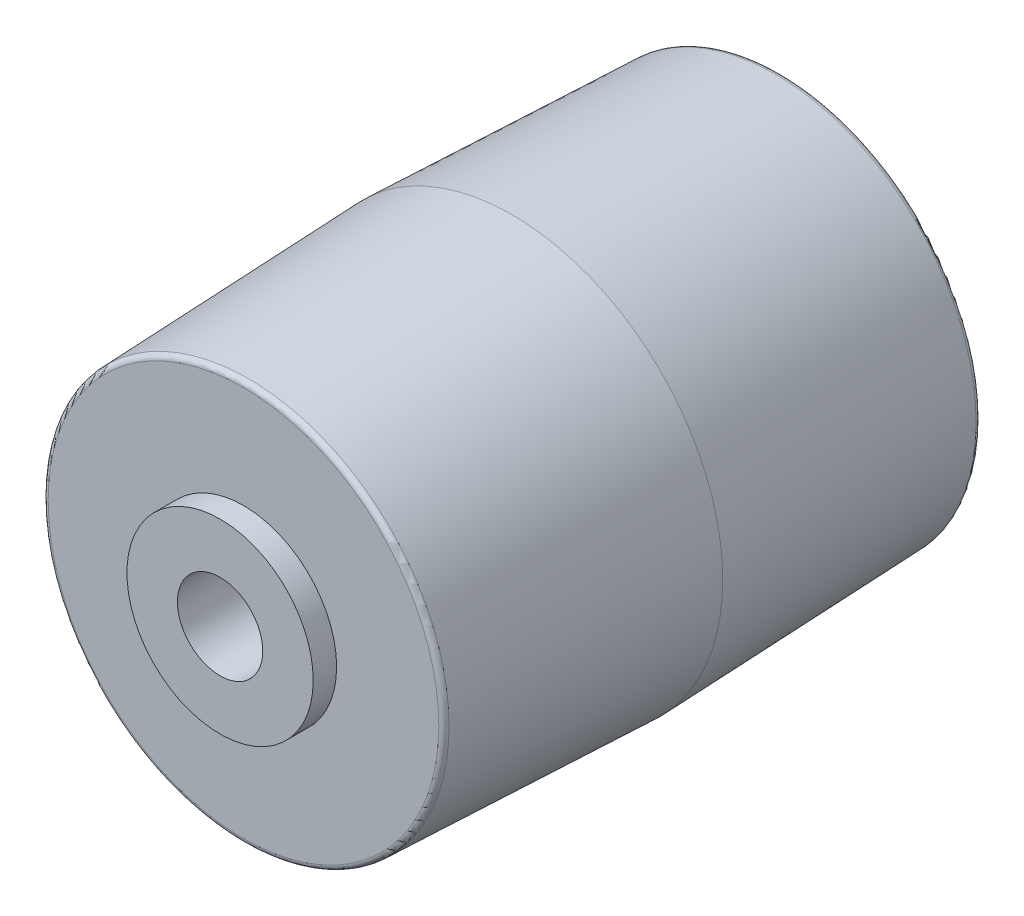
ISO-10303-21;
HEADER;
FILE_DESCRIPTION(('STEP AP214'),'2;1');
FILE_NAME('part.step','',(''),(''),'','','');
FILE_SCHEMA(('AUTOMOTIVE_DESIGN { 1 0 10303 214 1 1 1 1 }'));
ENDSEC;
DATA;
#1=APPLICATION_CONTEXT('core data for automotive mechanical design processes');
#2=APPLICATION_PROTOCOL_DEFINITION('international standard','automotive_design',2000,#1);
#3=PRODUCT_CONTEXT('',#1,'mechanical');
#4=PRODUCT('Part','Part','',(#3));
#5=PRODUCT_RELATED_PRODUCT_CATEGORY('part','',(#4));
#6=PRODUCT_DEFINITION_FORMATION('','',#4);
#7=PRODUCT_DEFINITION_CONTEXT('part definition',#1,'design');
#8=PRODUCT_DEFINITION('design','',#6,#7);
#9=PRODUCT_DEFINITION_SHAPE('','',#8);
#10=(LENGTH_UNIT() NAMED_UNIT(*) SI_UNIT(.MILLI.,.METRE.));
#11=(NAMED_UNIT(*) PLANE_ANGLE_UNIT() SI_UNIT($,.RADIAN.));
#12=(NAMED_UNIT(*) SI_UNIT($,.STERADIAN.) SOLID_ANGLE_UNIT());
#13=UNCERTAINTY_MEASURE_WITH_UNIT(LENGTH_MEASURE(1.E-05),#10,'distance_accuracy_value','');
#14=(GEOMETRIC_REPRESENTATION_CONTEXT(3) GLOBAL_UNCERTAINTY_ASSIGNED_CONTEXT((#13)) GLOBAL_UNIT_ASSIGNED_CONTEXT((#10,
#11,#12)) REPRESENTATION_CONTEXT('',''));
#15=CARTESIAN_POINT('',(0.,0.,0.));
#16=DIRECTION('',(0.,0.,1.));
#17=DIRECTION('',(1.,0.,0.));
#18=AXIS2_PLACEMENT_3D('',#15,#16,#17);
#19=CARTESIAN_POINT('',(0.,0.,-7.1247));
#20=DIRECTION('',(0.,0.,1.));
#21=DIRECTION('',(1.,0.,0.));
#22=AXIS2_PLACEMENT_3D('',#19,#20,#21);
#23=PLANE('',#22);
#24=CARTESIAN_POINT('',(0.,0.,-7.1247));
#25=DIRECTION('',(0.,0.,1.));
#26=DIRECTION('',(1.,0.,0.));
#27=AXIS2_PLACEMENT_3D('',#24,#25,#26);
#28=CIRCLE('',#27,1.0414);
#29=CARTESIAN_POINT('',(1.0414,0.,-7.1247));
#30=VERTEX_POINT('',#29);
#31=EDGE_CURVE('E75',#30,#30,#28,.T.);
#32=ORIENTED_EDGE('',*,*,#31,.T.);
#33=EDGE_LOOP('',(#32));
#34=FACE_BOUND('',#33,.T.);
#35=CARTESIAN_POINT('',(0.,0.,-7.1247));
#36=DIRECTION('',(0.,0.,1.));
#37=DIRECTION('',(1.,0.,0.));
#38=AXIS2_PLACEMENT_3D('',#35,#36,#37);
#39=CIRCLE('',#38,2.2733);
#40=CARTESIAN_POINT('',(2.2733,0.,-7.1247));
#41=VERTEX_POINT('',#40);
#42=EDGE_CURVE('E60',#41,#41,#39,.T.);
#43=ORIENTED_EDGE('',*,*,#42,.F.);
#44=EDGE_LOOP('',(#43));
#45=FACE_BOUND('',#44,.T.);
#46=ADVANCED_FACE('F40',(#34,#45),#23,.F.);
#47=CARTESIAN_POINT('',(0.,0.,7.1247));
#48=DIRECTION('',(0.,0.,1.));
#49=DIRECTION('',(1.,0.,0.));
#50=AXIS2_PLACEMENT_3D('',#47,#48,#49);
#51=CYLINDRICAL_SURFACE('',#50,2.2733);
#52=CARTESIAN_POINT('',(0.,0.,-6.5532));
#53=DIRECTION('',(0.,0.,1.));
#54=DIRECTION('',(1.,0.,0.));
#55=AXIS2_PLACEMENT_3D('',#52,#53,#54);
#56=CIRCLE('',#55,2.2733);
#57=CARTESIAN_POINT('',(2.2733,0.,-6.5532));
#58=VERTEX_POINT('',#57);
#59=EDGE_CURVE('E58',#58,#58,#56,.T.);
#60=ORIENTED_EDGE('',*,*,#59,.F.);
#61=EDGE_LOOP('',(#60));
#62=FACE_BOUND('',#61,.T.);
#63=ORIENTED_EDGE('',*,*,#42,.T.);
#64=EDGE_LOOP('',(#63));
#65=FACE_BOUND('',#64,.T.);
#66=ADVANCED_FACE('F114',(#62,#65),#51,.T.);
#67=CARTESIAN_POINT('',(0.,2.2733,-6.5532));
#68=DIRECTION('',(0.,0.,1.));
#69=DIRECTION('',(1.,0.,0.));
#70=AXIS2_PLACEMENT_3D('',#67,#68,#69);
#71=PLANE('',#70);
#72=CARTESIAN_POINT('',(0.,0.,-6.5532));
#73=DIRECTION('',(0.,0.,1.));
#74=DIRECTION('',(1.,0.,0.));
#75=AXIS2_PLACEMENT_3D('',#72,#73,#74);
#76=CIRCLE('',#75,4.76732711951104);
#77=CARTESIAN_POINT('',(4.76732711951104,0.,-6.5532));
#78=VERTEX_POINT('',#77);
#79=EDGE_CURVE('E10',#78,#78,#76,.F.);
#80=ORIENTED_EDGE('',*,*,#79,.T.);
#81=EDGE_LOOP('',(#80));
#82=FACE_BOUND('',#81,.T.);
#83=ORIENTED_EDGE('',*,*,#59,.T.);
#84=EDGE_LOOP('',(#83));
#85=FACE_BOUND('',#84,.T.);
#86=ADVANCED_FACE('F120',(#82,#85),#71,.F.);
#87=CARTESIAN_POINT('',(0.,0.,-6.5532));
#88=DIRECTION('',(0.,0.,1.));
#89=DIRECTION('',(1.,0.,0.));
#90=AXIS2_PLACEMENT_3D('',#87,#88,#89);
#91=CONICAL_SURFACE('',#90,4.8895,0.0387402976634796);
#92=CARTESIAN_POINT('',(0.,0.,-6.43111878722641));
#93=DIRECTION('',(0.,0.,-1.));
#94=DIRECTION('',(-1.,0.,0.));
#95=AXIS2_PLACEMENT_3D('',#92,#93,#94);
#96=CIRCLE('',#95,4.89423182995246);
#97=CARTESIAN_POINT('',(-4.89423182995246,0.,-6.43111878722641));
#98=VERTEX_POINT('',#97);
#99=EDGE_CURVE('E42',#98,#98,#96,.F.);
#100=ORIENTED_EDGE('',*,*,#99,.T.);
#101=EDGE_LOOP('',(#100));
#102=FACE_BOUND('',#101,.T.);
#103=CARTESIAN_POINT('',(0.,0.,0.));
#104=DIRECTION('',(0.,0.,1.));
#105=DIRECTION('',(1.,0.,0.));
#106=AXIS2_PLACEMENT_3D('',#103,#104,#105);
#107=CIRCLE('',#106,5.1435);
#108=CARTESIAN_POINT('',(5.1435,0.,0.));
#109=VERTEX_POINT('',#108);
#110=EDGE_CURVE('E65',#109,#109,#107,.T.);
#111=ORIENTED_EDGE('',*,*,#110,.F.);
#112=EDGE_LOOP('',(#111));
#113=FACE_BOUND('',#112,.T.);
#114=ADVANCED_FACE('F108',(#102,#113),#91,.T.);
#115=CARTESIAN_POINT('',(0.,0.,0.));
#116=DIRECTION('',(0.,0.,-1.));
#117=DIRECTION('',(-1.,0.,0.));
#118=AXIS2_PLACEMENT_3D('',#115,#116,#117);
#119=CONICAL_SURFACE('',#118,5.1435,0.0387402976634796);
#120=CARTESIAN_POINT('',(0.,0.,6.43111878722641));
#121=DIRECTION('',(0.,0.,1.));
#122=DIRECTION('',(1.,0.,0.));
#123=AXIS2_PLACEMENT_3D('',#120,#121,#122);
#124=CIRCLE('',#123,4.89423182995246);
#125=CARTESIAN_POINT('',(4.89423182995246,0.,6.43111878722641));
#126=VERTEX_POINT('',#125);
#127=EDGE_CURVE('E48',#126,#126,#124,.F.);
#128=ORIENTED_EDGE('',*,*,#127,.T.);
#129=EDGE_LOOP('',(#128));
#130=FACE_BOUND('',#129,.T.);
#131=ORIENTED_EDGE('',*,*,#110,.T.);
#132=EDGE_LOOP('',(#131));
#133=FACE_BOUND('',#132,.T.);
#134=ADVANCED_FACE('F105',(#130,#133),#119,.T.);
#135=CARTESIAN_POINT('',(0.,2.2733,6.5532));
#136=DIRECTION('',(0.,0.,-1.));
#137=DIRECTION('',(-1.,0.,0.));
#138=AXIS2_PLACEMENT_3D('',#135,#136,#137);
#139=PLANE('',#138);
#140=CARTESIAN_POINT('',(0.,0.,6.5532));
#141=DIRECTION('',(0.,0.,-1.));
#142=DIRECTION('',(-1.,0.,0.));
#143=AXIS2_PLACEMENT_3D('',#140,#141,#142);
#144=CIRCLE('',#143,4.76732711951104);
#145=CARTESIAN_POINT('',(-4.76732711951104,0.,6.5532));
#146=VERTEX_POINT('',#145);
#147=EDGE_CURVE('E55',#146,#146,#144,.F.);
#148=ORIENTED_EDGE('',*,*,#147,.T.);
#149=EDGE_LOOP('',(#148));
#150=FACE_BOUND('',#149,.T.);
#151=CARTESIAN_POINT('',(0.,0.,6.5532));
#152=DIRECTION('',(0.,0.,1.));
#153=DIRECTION('',(1.,0.,0.));
#154=AXIS2_PLACEMENT_3D('',#151,#152,#153);
#155=CIRCLE('',#154,2.2733);
#156=CARTESIAN_POINT('',(2.2733,0.,6.5532));
#157=VERTEX_POINT('',#156);
#158=EDGE_CURVE('E67',#157,#157,#155,.T.);
#159=ORIENTED_EDGE('',*,*,#158,.F.);
#160=EDGE_LOOP('',(#159));
#161=FACE_BOUND('',#160,.T.);
#162=ADVANCED_FACE('F100',(#150,#161),#139,.F.);
#163=CARTESIAN_POINT('',(0.,0.,7.1247));
#164=DIRECTION('',(0.,0.,1.));
#165=DIRECTION('',(1.,0.,0.));
#166=AXIS2_PLACEMENT_3D('',#163,#164,#165);
#167=CYLINDRICAL_SURFACE('',#166,2.2733);
#168=CARTESIAN_POINT('',(0.,0.,7.1247));
#169=DIRECTION('',(0.,0.,1.));
#170=DIRECTION('',(1.,0.,0.));
#171=AXIS2_PLACEMENT_3D('',#168,#169,#170);
#172=CIRCLE('',#171,2.2733);
#173=CARTESIAN_POINT('',(2.2733,0.,7.1247));
#174=VERTEX_POINT('',#173);
#175=EDGE_CURVE('E66',#174,#174,#172,.T.);
#176=ORIENTED_EDGE('',*,*,#175,.F.);
#177=EDGE_LOOP('',(#176));
#178=FACE_BOUND('',#177,.T.);
#179=ORIENTED_EDGE('',*,*,#158,.T.);
#180=EDGE_LOOP('',(#179));
#181=FACE_BOUND('',#180,.T.);
#182=ADVANCED_FACE('F93',(#178,#181),#167,.T.);
#183=CARTESIAN_POINT('',(0.,0.,7.1247));
#184=DIRECTION('',(0.,0.,-1.));
#185=DIRECTION('',(-1.,0.,0.));
#186=AXIS2_PLACEMENT_3D('',#183,#184,#185);
#187=PLANE('',#186);
#188=CARTESIAN_POINT('',(0.,0.,7.1247));
#189=DIRECTION('',(0.,0.,1.));
#190=DIRECTION('',(1.,0.,0.));
#191=AXIS2_PLACEMENT_3D('',#188,#189,#190);
#192=CIRCLE('',#191,1.0414);
#193=CARTESIAN_POINT('',(1.0414,0.,7.1247));
#194=VERTEX_POINT('',#193);
#195=EDGE_CURVE('E71',#194,#194,#192,.T.);
#196=ORIENTED_EDGE('',*,*,#195,.F.);
#197=EDGE_LOOP('',(#196));
#198=FACE_BOUND('',#197,.T.);
#199=ORIENTED_EDGE('',*,*,#175,.T.);
#200=EDGE_LOOP('',(#199));
#201=FACE_BOUND('',#200,.T.);
#202=ADVANCED_FACE('F83',(#198,#201),#187,.F.);
#203=CARTESIAN_POINT('',(0.,0.,-7.1247));
#204=DIRECTION('',(0.,0.,1.));
#205=DIRECTION('',(1.,0.,0.));
#206=AXIS2_PLACEMENT_3D('',#203,#204,#205);
#207=CYLINDRICAL_SURFACE('',#206,1.0414);
#208=ORIENTED_EDGE('',*,*,#31,.F.);
#209=EDGE_LOOP('',(#208));
#210=FACE_BOUND('',#209,.T.);
#211=ORIENTED_EDGE('',*,*,#195,.T.);
#212=EDGE_LOOP('',(#211));
#213=FACE_BOUND('',#212,.T.);
#214=ADVANCED_FACE('F82',(#210,#213),#207,.F.);
#215=CARTESIAN_POINT('',(0.,0.,6.4262));
#216=DIRECTION('',(0.,0.,-1.));
#217=DIRECTION('',(-1.,0.,0.));
#218=AXIS2_PLACEMENT_3D('',#215,#216,#217);
#219=TOROIDAL_SURFACE('',#218,4.76732711951104,0.127);
#220=ORIENTED_EDGE('',*,*,#127,.F.);
#221=EDGE_LOOP('',(#220));
#222=FACE_BOUND('',#221,.T.);
#223=ORIENTED_EDGE('',*,*,#147,.F.);
#224=EDGE_LOOP('',(#223));
#225=FACE_BOUND('',#224,.T.);
#226=ADVANCED_FACE('F81',(#222,#225),#219,.T.);
#227=CARTESIAN_POINT('',(0.,0.,-6.4262));
#228=DIRECTION('',(0.,0.,1.));
#229=DIRECTION('',(1.,0.,0.));
#230=AXIS2_PLACEMENT_3D('',#227,#228,#229);
#231=TOROIDAL_SURFACE('',#230,4.76732711951104,0.127);
#232=ORIENTED_EDGE('',*,*,#79,.F.);
#233=EDGE_LOOP('',(#232));
#234=FACE_BOUND('',#233,.T.);
#235=ORIENTED_EDGE('',*,*,#99,.F.);
#236=EDGE_LOOP('',(#235));
#237=FACE_BOUND('',#236,.T.);
#238=ADVANCED_FACE('F39',(#234,#237),#231,.T.);
#239=CLOSED_SHELL('',(#46,#66,#86,#114,#134,#162,#182,#202,#214,#226,#238));
#240=MANIFOLD_SOLID_BREP('B2',#239);
#241=ADVANCED_BREP_SHAPE_REPRESENTATION('',(#18,#240),#14);
#242=SHAPE_DEFINITION_REPRESENTATION(#9,#241);
ENDSEC;
END-ISO-10303-21;
